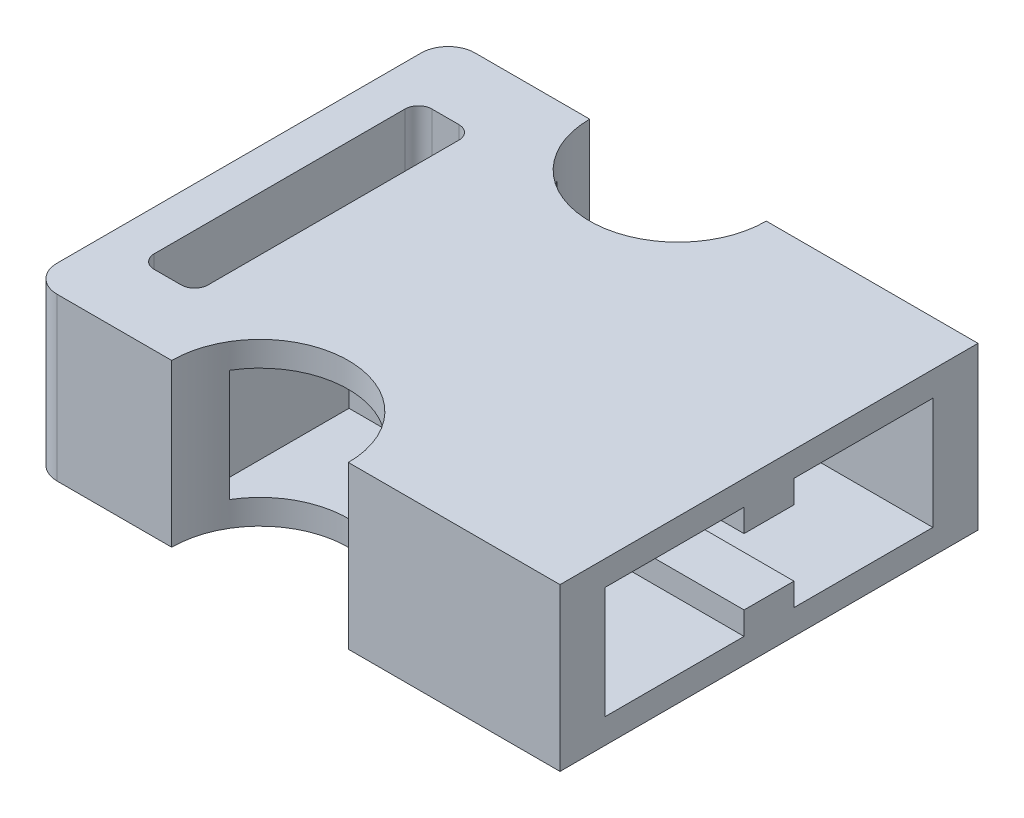
ISO-10303-21;
HEADER;
FILE_DESCRIPTION(('STEP AP214'),'2;1');
FILE_NAME('part.step','',(''),(''),'','','');
FILE_SCHEMA(('AUTOMOTIVE_DESIGN { 1 0 10303 214 1 1 1 1 }'));
ENDSEC;
DATA;
#1=APPLICATION_CONTEXT('core data for automotive mechanical design processes');
#2=APPLICATION_PROTOCOL_DEFINITION('international standard','automotive_design',2000,#1);
#3=PRODUCT_CONTEXT('',#1,'mechanical');
#4=PRODUCT('Part','Part','',(#3));
#5=PRODUCT_RELATED_PRODUCT_CATEGORY('part','',(#4));
#6=PRODUCT_DEFINITION_FORMATION('','',#4);
#7=PRODUCT_DEFINITION_CONTEXT('part definition',#1,'design');
#8=PRODUCT_DEFINITION('design','',#6,#7);
#9=PRODUCT_DEFINITION_SHAPE('','',#8);
#10=(LENGTH_UNIT() NAMED_UNIT(*) SI_UNIT(.MILLI.,.METRE.));
#11=(NAMED_UNIT(*) PLANE_ANGLE_UNIT() SI_UNIT($,.RADIAN.));
#12=(NAMED_UNIT(*) SI_UNIT($,.STERADIAN.) SOLID_ANGLE_UNIT());
#13=UNCERTAINTY_MEASURE_WITH_UNIT(LENGTH_MEASURE(1.E-05),#10,'distance_accuracy_value','');
#14=(GEOMETRIC_REPRESENTATION_CONTEXT(3) GLOBAL_UNCERTAINTY_ASSIGNED_CONTEXT((#13)) GLOBAL_UNIT_ASSIGNED_CONTEXT((#10,
#11,#12)) REPRESENTATION_CONTEXT('',''));
#15=CARTESIAN_POINT('',(0.,0.,0.));
#16=DIRECTION('',(0.,0.,1.));
#17=DIRECTION('',(1.,0.,0.));
#18=AXIS2_PLACEMENT_3D('',#15,#16,#17);
#19=CARTESIAN_POINT('',(0.,12.8905,0.));
#20=DIRECTION('',(0.,-1.,0.));
#21=DIRECTION('',(0.,0.,-1.));
#22=AXIS2_PLACEMENT_3D('',#19,#20,#21);
#23=PLANE('',#22);
#24=DIRECTION('',(0.,0.,1.));
#25=VECTOR('',#24,1.);
#26=CARTESIAN_POINT('',(12.7,12.8905,-35.1155));
#27=LINE('',#26,#25);
#28=CARTESIAN_POINT('',(12.7,12.8905,-17.3355));
#29=VERTEX_POINT('',#28);
#30=CARTESIAN_POINT('',(12.7,12.8905,-4.2545));
#31=VERTEX_POINT('',#30);
#32=EDGE_CURVE('E364',#29,#31,#27,.T.);
#33=ORIENTED_EDGE('',*,*,#32,.F.);
#34=DIRECTION('',(1.,0.,0.));
#35=VECTOR('',#34,1.);
#36=CARTESIAN_POINT('',(12.7,12.8905,-17.3355));
#37=LINE('',#36,#35);
#38=CARTESIAN_POINT('',(49.911,12.8905,-17.3355));
#39=VERTEX_POINT('',#38);
#40=EDGE_CURVE('E660',#29,#39,#37,.T.);
#41=ORIENTED_EDGE('',*,*,#40,.T.);
#42=DIRECTION('',(0.,0.,-1.));
#43=VECTOR('',#42,1.);
#44=CARTESIAN_POINT('',(49.911,12.8905,-35.1155));
#45=LINE('',#44,#43);
#46=CARTESIAN_POINT('',(49.911,12.8905,-4.2545));
#47=VERTEX_POINT('',#46);
#48=EDGE_CURVE('E354',#47,#39,#45,.T.);
#49=ORIENTED_EDGE('',*,*,#48,.F.);
#50=DIRECTION('',(1.,0.,0.));
#51=VECTOR('',#50,1.);
#52=CARTESIAN_POINT('',(49.911,12.8905,-4.2545));
#53=LINE('',#52,#51);
#54=CARTESIAN_POINT('',(28.8016936179709,12.8905,-4.2545));
#55=VERTEX_POINT('',#54);
#56=EDGE_CURVE('E370',#55,#47,#53,.T.);
#57=ORIENTED_EDGE('',*,*,#56,.F.);
#58=CARTESIAN_POINT('',(21.6535,12.8905,0.));
#59=DIRECTION('',(0.,-1.,0.));
#60=DIRECTION('',(0.,0.,-1.));
#61=AXIS2_PLACEMENT_3D('',#58,#59,#60);
#62=CIRCLE('',#61,8.3185);
#63=CARTESIAN_POINT('',(14.5053063820291,12.8905,-4.2545));
#64=VERTEX_POINT('',#63);
#65=EDGE_CURVE('E376',#55,#64,#62,.F.);
#66=ORIENTED_EDGE('',*,*,#65,.T.);
#67=EDGE_CURVE('E368',#31,#64,#53,.T.);
#68=ORIENTED_EDGE('',*,*,#67,.F.);
#69=EDGE_LOOP('',(#33,#41,#49,#57,#66,#68));
#70=FACE_BOUND('',#69,.T.);
#71=ADVANCED_FACE('F44',(#70),#23,.T.);
#72=CARTESIAN_POINT('',(49.911,12.8905,-22.0345));
#73=VERTEX_POINT('',#72);
#74=CARTESIAN_POINT('',(49.911,12.8905,-35.1155));
#75=VERTEX_POINT('',#74);
#76=EDGE_CURVE('E333',#73,#75,#45,.T.);
#77=ORIENTED_EDGE('',*,*,#76,.F.);
#78=DIRECTION('',(-1.,0.,0.));
#79=VECTOR('',#78,1.);
#80=CARTESIAN_POINT('',(12.7,12.8905,-22.0345));
#81=LINE('',#80,#79);
#82=CARTESIAN_POINT('',(12.7,12.8905,-22.0345));
#83=VERTEX_POINT('',#82);
#84=EDGE_CURVE('E665',#73,#83,#81,.T.);
#85=ORIENTED_EDGE('',*,*,#84,.T.);
#86=CARTESIAN_POINT('',(12.7,12.8905,-35.1155));
#87=VERTEX_POINT('',#86);
#88=EDGE_CURVE('E293',#87,#83,#27,.T.);
#89=ORIENTED_EDGE('',*,*,#88,.F.);
#90=DIRECTION('',(-1.,0.,0.));
#91=VECTOR('',#90,1.);
#92=CARTESIAN_POINT('',(49.911,12.8905,-35.1155));
#93=LINE('',#92,#91);
#94=CARTESIAN_POINT('',(14.5053063820291,12.8905,-35.1155));
#95=VERTEX_POINT('',#94);
#96=EDGE_CURVE('E360',#95,#87,#93,.T.);
#97=ORIENTED_EDGE('',*,*,#96,.F.);
#98=CARTESIAN_POINT('',(21.6535,12.8905,-39.37));
#99=DIRECTION('',(0.,-1.,0.));
#100=DIRECTION('',(0.,0.,-1.));
#101=AXIS2_PLACEMENT_3D('',#98,#99,#100);
#102=CIRCLE('',#101,8.3185);
#103=CARTESIAN_POINT('',(28.8016936179709,12.8905,-35.1155));
#104=VERTEX_POINT('',#103);
#105=EDGE_CURVE('E589',#95,#104,#102,.F.);
#106=ORIENTED_EDGE('',*,*,#105,.T.);
#107=EDGE_CURVE('E359',#75,#104,#93,.T.);
#108=ORIENTED_EDGE('',*,*,#107,.F.);
#109=EDGE_LOOP('',(#77,#85,#89,#97,#106,#108));
#110=FACE_BOUND('',#109,.T.);
#111=ADVANCED_FACE('F623',(#110),#23,.T.);
#112=CARTESIAN_POINT('',(12.7,2.3495,-35.1155));
#113=DIRECTION('',(-1.,0.,0.));
#114=DIRECTION('',(0.,0.,1.));
#115=AXIS2_PLACEMENT_3D('',#112,#113,#114);
#116=PLANE('',#115);
#117=DIRECTION('',(0.,1.,0.));
#118=VECTOR('',#117,1.);
#119=CARTESIAN_POINT('',(12.7,10.7315,-22.0345));
#120=LINE('',#119,#118);
#121=CARTESIAN_POINT('',(12.7,10.7315,-22.0345));
#122=VERTEX_POINT('',#121);
#123=EDGE_CURVE('E283',#122,#83,#120,.T.);
#124=ORIENTED_EDGE('',*,*,#123,.F.);
#125=DIRECTION('',(0.,0.,1.));
#126=VECTOR('',#125,1.);
#127=CARTESIAN_POINT('',(12.7,10.7315,-22.0345));
#128=LINE('',#127,#126);
#129=CARTESIAN_POINT('',(12.7,10.7315,-17.3355));
#130=VERTEX_POINT('',#129);
#131=EDGE_CURVE('E268',#122,#130,#128,.T.);
#132=ORIENTED_EDGE('',*,*,#131,.T.);
#133=DIRECTION('',(0.,1.,0.));
#134=VECTOR('',#133,1.);
#135=CARTESIAN_POINT('',(12.7,10.7315,-17.3355));
#136=LINE('',#135,#134);
#137=EDGE_CURVE('E291',#130,#29,#136,.T.);
#138=ORIENTED_EDGE('',*,*,#137,.T.);
#139=ORIENTED_EDGE('',*,*,#32,.T.);
#140=DIRECTION('',(0.,1.,0.));
#141=VECTOR('',#140,1.);
#142=CARTESIAN_POINT('',(12.7,2.3495,-4.2545));
#143=LINE('',#142,#141);
#144=CARTESIAN_POINT('',(12.7,2.3495,-4.2545));
#145=VERTEX_POINT('',#144);
#146=EDGE_CURVE('E380',#145,#31,#143,.T.);
#147=ORIENTED_EDGE('',*,*,#146,.F.);
#148=DIRECTION('',(0.,0.,1.));
#149=VECTOR('',#148,1.);
#150=CARTESIAN_POINT('',(12.7,2.3495,-35.1155));
#151=LINE('',#150,#149);
#152=CARTESIAN_POINT('',(12.7,2.3495,-17.3355));
#153=VERTEX_POINT('',#152);
#154=EDGE_CURVE('E343',#153,#145,#151,.T.);
#155=ORIENTED_EDGE('',*,*,#154,.F.);
#156=DIRECTION('',(0.,-1.,0.));
#157=VECTOR('',#156,1.);
#158=CARTESIAN_POINT('',(12.7,4.5085,-17.3355));
#159=LINE('',#158,#157);
#160=CARTESIAN_POINT('',(12.7,4.5085,-17.3355));
#161=VERTEX_POINT('',#160);
#162=EDGE_CURVE('E320',#161,#153,#159,.T.);
#163=ORIENTED_EDGE('',*,*,#162,.F.);
#164=DIRECTION('',(0.,0.,1.));
#165=VECTOR('',#164,1.);
#166=CARTESIAN_POINT('',(12.7,4.5085,-22.0345));
#167=LINE('',#166,#165);
#168=CARTESIAN_POINT('',(12.7,4.5085,-22.0345));
#169=VERTEX_POINT('',#168);
#170=EDGE_CURVE('E313',#169,#161,#167,.T.);
#171=ORIENTED_EDGE('',*,*,#170,.F.);
#172=DIRECTION('',(0.,-1.,0.));
#173=VECTOR('',#172,1.);
#174=CARTESIAN_POINT('',(12.7,4.5085,-22.0345));
#175=LINE('',#174,#173);
#176=CARTESIAN_POINT('',(12.7,2.3495,-22.0345));
#177=VERTEX_POINT('',#176);
#178=EDGE_CURVE('E70',#169,#177,#175,.T.);
#179=ORIENTED_EDGE('',*,*,#178,.T.);
#180=CARTESIAN_POINT('',(12.7,2.3495,-35.1155));
#181=VERTEX_POINT('',#180);
#182=EDGE_CURVE('E342',#181,#177,#151,.T.);
#183=ORIENTED_EDGE('',*,*,#182,.F.);
#184=DIRECTION('',(0.,1.,0.));
#185=VECTOR('',#184,1.);
#186=CARTESIAN_POINT('',(12.7,2.3495,-35.1155));
#187=LINE('',#186,#185);
#188=EDGE_CURVE('E382',#181,#87,#187,.T.);
#189=ORIENTED_EDGE('',*,*,#188,.T.);
#190=ORIENTED_EDGE('',*,*,#88,.T.);
#191=EDGE_LOOP('',(#124,#132,#138,#139,#147,#155,#163,#171,#179,#183,#189,#190));
#192=FACE_BOUND('',#191,.T.);
#193=ADVANCED_FACE('F288',(#192),#116,.F.);
#194=CARTESIAN_POINT('',(0.,2.3495,0.));
#195=DIRECTION('',(0.,-1.,0.));
#196=DIRECTION('',(0.,0.,-1.));
#197=AXIS2_PLACEMENT_3D('',#194,#195,#196);
#198=PLANE('',#197);
#199=DIRECTION('',(1.,0.,0.));
#200=VECTOR('',#199,1.);
#201=CARTESIAN_POINT('',(12.7,2.3495,-17.3355));
#202=LINE('',#201,#200);
#203=CARTESIAN_POINT('',(49.911,2.3495,-17.3355));
#204=VERTEX_POINT('',#203);
#205=EDGE_CURVE('E300',#153,#204,#202,.T.);
#206=ORIENTED_EDGE('',*,*,#205,.F.);
#207=ORIENTED_EDGE('',*,*,#154,.T.);
#208=DIRECTION('',(1.,0.,0.));
#209=VECTOR('',#208,1.);
#210=CARTESIAN_POINT('',(49.911,2.3495,-4.2545));
#211=LINE('',#210,#209);
#212=CARTESIAN_POINT('',(14.5053063820291,2.3495,-4.2545));
#213=VERTEX_POINT('',#212);
#214=EDGE_CURVE('E346',#145,#213,#211,.T.);
#215=ORIENTED_EDGE('',*,*,#214,.T.);
#216=CARTESIAN_POINT('',(21.6535,2.3495,0.));
#217=DIRECTION('',(0.,-1.,0.));
#218=DIRECTION('',(0.,0.,-1.));
#219=AXIS2_PLACEMENT_3D('',#216,#217,#218);
#220=CIRCLE('',#219,8.3185);
#221=CARTESIAN_POINT('',(28.8016936179709,2.3495,-4.2545));
#222=VERTEX_POINT('',#221);
#223=EDGE_CURVE('E388',#222,#213,#220,.F.);
#224=ORIENTED_EDGE('',*,*,#223,.F.);
#225=CARTESIAN_POINT('',(49.911,2.3495,-4.2545));
#226=VERTEX_POINT('',#225);
#227=EDGE_CURVE('E350',#222,#226,#211,.T.);
#228=ORIENTED_EDGE('',*,*,#227,.T.);
#229=DIRECTION('',(0.,0.,-1.));
#230=VECTOR('',#229,1.);
#231=CARTESIAN_POINT('',(49.911,2.3495,-35.1155));
#232=LINE('',#231,#230);
#233=EDGE_CURVE('E332',#226,#204,#232,.T.);
#234=ORIENTED_EDGE('',*,*,#233,.T.);
#235=EDGE_LOOP('',(#206,#207,#215,#224,#228,#234));
#236=FACE_BOUND('',#235,.T.);
#237=ADVANCED_FACE('F633',(#236),#198,.F.);
#238=DIRECTION('',(-1.,0.,0.));
#239=VECTOR('',#238,1.);
#240=CARTESIAN_POINT('',(12.7,2.3495,-22.0345));
#241=LINE('',#240,#239);
#242=CARTESIAN_POINT('',(49.911,2.3495,-22.0345));
#243=VERTEX_POINT('',#242);
#244=EDGE_CURVE('E308',#243,#177,#241,.T.);
#245=ORIENTED_EDGE('',*,*,#244,.F.);
#246=CARTESIAN_POINT('',(49.911,2.3495,-35.1155));
#247=VERTEX_POINT('',#246);
#248=EDGE_CURVE('E339',#243,#247,#232,.T.);
#249=ORIENTED_EDGE('',*,*,#248,.T.);
#250=DIRECTION('',(-1.,0.,0.));
#251=VECTOR('',#250,1.);
#252=CARTESIAN_POINT('',(49.911,2.3495,-35.1155));
#253=LINE('',#252,#251);
#254=CARTESIAN_POINT('',(28.8016936179709,2.3495,-35.1155));
#255=VERTEX_POINT('',#254);
#256=EDGE_CURVE('E338',#247,#255,#253,.T.);
#257=ORIENTED_EDGE('',*,*,#256,.T.);
#258=CARTESIAN_POINT('',(21.6535,2.3495,-39.37));
#259=DIRECTION('',(0.,-1.,0.));
#260=DIRECTION('',(0.,0.,-1.));
#261=AXIS2_PLACEMENT_3D('',#258,#259,#260);
#262=CIRCLE('',#261,8.3185);
#263=CARTESIAN_POINT('',(14.5053063820291,2.3495,-35.1155));
#264=VERTEX_POINT('',#263);
#265=EDGE_CURVE('E11',#264,#255,#262,.F.);
#266=ORIENTED_EDGE('',*,*,#265,.F.);
#267=EDGE_CURVE('E336',#264,#181,#253,.T.);
#268=ORIENTED_EDGE('',*,*,#267,.T.);
#269=ORIENTED_EDGE('',*,*,#182,.T.);
#270=EDGE_LOOP('',(#245,#249,#257,#266,#268,#269));
#271=FACE_BOUND('',#270,.T.);
#272=ADVANCED_FACE('F608',(#271),#198,.F.);
#273=CARTESIAN_POINT('',(49.911,15.24,-39.37));
#274=DIRECTION('',(-1.,0.,0.));
#275=DIRECTION('',(0.,0.,1.));
#276=AXIS2_PLACEMENT_3D('',#273,#274,#275);
#277=PLANE('',#276);
#278=DIRECTION('',(0.,0.,-1.));
#279=VECTOR('',#278,1.);
#280=CARTESIAN_POINT('',(49.911,0.,-39.37));
#281=LINE('',#280,#279);
#282=CARTESIAN_POINT('',(49.911,0.,0.));
#283=VERTEX_POINT('',#282);
#284=CARTESIAN_POINT('',(49.911,0.,-39.37));
#285=VERTEX_POINT('',#284);
#286=EDGE_CURVE('E424',#283,#285,#281,.T.);
#287=ORIENTED_EDGE('',*,*,#286,.T.);
#288=DIRECTION('',(0.,-1.,0.));
#289=VECTOR('',#288,1.);
#290=CARTESIAN_POINT('',(49.911,15.24,-39.37));
#291=LINE('',#290,#289);
#292=CARTESIAN_POINT('',(49.911,15.24,-39.37));
#293=VERTEX_POINT('',#292);
#294=EDGE_CURVE('E441',#293,#285,#291,.T.);
#295=ORIENTED_EDGE('',*,*,#294,.F.);
#296=DIRECTION('',(0.,0.,-1.));
#297=VECTOR('',#296,1.);
#298=CARTESIAN_POINT('',(49.911,15.24,-39.37));
#299=LINE('',#298,#297);
#300=CARTESIAN_POINT('',(49.911,15.24,0.));
#301=VERTEX_POINT('',#300);
#302=EDGE_CURVE('E408',#301,#293,#299,.T.);
#303=ORIENTED_EDGE('',*,*,#302,.F.);
#304=DIRECTION('',(0.,-1.,0.));
#305=VECTOR('',#304,1.);
#306=CARTESIAN_POINT('',(49.911,15.24,0.));
#307=LINE('',#306,#305);
#308=EDGE_CURVE('E444',#301,#283,#307,.T.);
#309=ORIENTED_EDGE('',*,*,#308,.T.);
#310=EDGE_LOOP('',(#287,#295,#303,#309));
#311=FACE_BOUND('',#310,.T.);
#312=ORIENTED_EDGE('',*,*,#233,.F.);
#313=DIRECTION('',(0.,1.,0.));
#314=VECTOR('',#313,1.);
#315=CARTESIAN_POINT('',(49.911,2.3495,-4.2545));
#316=LINE('',#315,#314);
#317=EDGE_CURVE('E375',#226,#47,#316,.T.);
#318=ORIENTED_EDGE('',*,*,#317,.T.);
#319=ORIENTED_EDGE('',*,*,#48,.T.);
#320=DIRECTION('',(0.,1.,0.));
#321=VECTOR('',#320,1.);
#322=CARTESIAN_POINT('',(49.911,10.7315,-17.3355));
#323=LINE('',#322,#321);
#324=CARTESIAN_POINT('',(49.911,10.7315,-17.3355));
#325=VERTEX_POINT('',#324);
#326=EDGE_CURVE('E299',#325,#39,#323,.T.);
#327=ORIENTED_EDGE('',*,*,#326,.F.);
#328=DIRECTION('',(0.,0.,-1.));
#329=VECTOR('',#328,1.);
#330=CARTESIAN_POINT('',(49.911,10.7315,-17.3355));
#331=LINE('',#330,#329);
#332=CARTESIAN_POINT('',(49.911,10.7315,-22.0345));
#333=VERTEX_POINT('',#332);
#334=EDGE_CURVE('E281',#325,#333,#331,.T.);
#335=ORIENTED_EDGE('',*,*,#334,.T.);
#336=DIRECTION('',(0.,1.,0.));
#337=VECTOR('',#336,1.);
#338=CARTESIAN_POINT('',(49.911,10.7315,-22.0345));
#339=LINE('',#338,#337);
#340=EDGE_CURVE('E282',#333,#73,#339,.T.);
#341=ORIENTED_EDGE('',*,*,#340,.T.);
#342=ORIENTED_EDGE('',*,*,#76,.T.);
#343=DIRECTION('',(0.,1.,0.));
#344=VECTOR('',#343,1.);
#345=CARTESIAN_POINT('',(49.911,2.3495,-35.1155));
#346=LINE('',#345,#344);
#347=EDGE_CURVE('E352',#247,#75,#346,.T.);
#348=ORIENTED_EDGE('',*,*,#347,.F.);
#349=ORIENTED_EDGE('',*,*,#248,.F.);
#350=DIRECTION('',(0.,-1.,0.));
#351=VECTOR('',#350,1.);
#352=CARTESIAN_POINT('',(49.911,4.5085,-22.0345));
#353=LINE('',#352,#351);
#354=CARTESIAN_POINT('',(49.911,4.5085,-22.0345));
#355=VERTEX_POINT('',#354);
#356=EDGE_CURVE('E329',#355,#243,#353,.T.);
#357=ORIENTED_EDGE('',*,*,#356,.F.);
#358=DIRECTION('',(0.,0.,-1.));
#359=VECTOR('',#358,1.);
#360=CARTESIAN_POINT('',(49.911,4.5085,-17.3355));
#361=LINE('',#360,#359);
#362=CARTESIAN_POINT('',(49.911,4.5085,-17.3355));
#363=VERTEX_POINT('',#362);
#364=EDGE_CURVE('E310',#363,#355,#361,.T.);
#365=ORIENTED_EDGE('',*,*,#364,.F.);
#366=DIRECTION('',(0.,-1.,0.));
#367=VECTOR('',#366,1.);
#368=CARTESIAN_POINT('',(49.911,4.5085,-17.3355));
#369=LINE('',#368,#367);
#370=EDGE_CURVE('E326',#363,#204,#369,.T.);
#371=ORIENTED_EDGE('',*,*,#370,.T.);
#372=EDGE_LOOP('',(#312,#318,#319,#327,#335,#341,#342,#348,#349,#357,#365,#371));
#373=FACE_BOUND('',#372,.T.);
#374=ADVANCED_FACE('F620',(#311,#373),#277,.F.);
#375=CARTESIAN_POINT('',(2.54,15.24,-36.83));
#376=DIRECTION('',(0.,1.,0.));
#377=DIRECTION('',(0.,0.,1.));
#378=AXIS2_PLACEMENT_3D('',#375,#376,#377);
#379=PLANE('',#378);
#380=DIRECTION('',(1.,0.,0.));
#381=VECTOR('',#380,1.);
#382=CARTESIAN_POINT('',(10.16,15.24,0.));
#383=LINE('',#382,#381);
#384=CARTESIAN_POINT('',(2.54,15.24,0.));
#385=VERTEX_POINT('',#384);
#386=CARTESIAN_POINT('',(13.335,15.24,0.));
#387=VERTEX_POINT('',#386);
#388=EDGE_CURVE('E543',#385,#387,#383,.T.);
#389=ORIENTED_EDGE('',*,*,#388,.T.);
#390=CARTESIAN_POINT('',(21.6535,15.24,0.));
#391=DIRECTION('',(0.,-1.,0.));
#392=DIRECTION('',(0.,0.,-1.));
#393=AXIS2_PLACEMENT_3D('',#390,#391,#392);
#394=CIRCLE('',#393,8.3185);
#395=CARTESIAN_POINT('',(29.972,15.24,0.));
#396=VERTEX_POINT('',#395);
#397=EDGE_CURVE('E405',#387,#396,#394,.T.);
#398=ORIENTED_EDGE('',*,*,#397,.T.);
#399=DIRECTION('',(1.,0.,0.));
#400=VECTOR('',#399,1.);
#401=CARTESIAN_POINT('',(29.972,15.24,0.));
#402=LINE('',#401,#400);
#403=EDGE_CURVE('E403',#396,#301,#402,.T.);
#404=ORIENTED_EDGE('',*,*,#403,.T.);
#405=ORIENTED_EDGE('',*,*,#302,.T.);
#406=DIRECTION('',(-1.,0.,0.));
#407=VECTOR('',#406,1.);
#408=CARTESIAN_POINT('',(29.972,15.24,-39.37));
#409=LINE('',#408,#407);
#410=CARTESIAN_POINT('',(29.972,15.24,-39.37));
#411=VERTEX_POINT('',#410);
#412=EDGE_CURVE('E414',#293,#411,#409,.T.);
#413=ORIENTED_EDGE('',*,*,#412,.T.);
#414=CARTESIAN_POINT('',(21.6535,15.24,-39.37));
#415=DIRECTION('',(0.,-1.,0.));
#416=DIRECTION('',(0.,0.,1.));
#417=AXIS2_PLACEMENT_3D('',#414,#415,#416);
#418=CIRCLE('',#417,8.3185);
#419=CARTESIAN_POINT('',(13.335,15.24,-39.37));
#420=VERTEX_POINT('',#419);
#421=EDGE_CURVE('E411',#411,#420,#418,.T.);
#422=ORIENTED_EDGE('',*,*,#421,.T.);
#423=DIRECTION('',(-1.,0.,0.));
#424=VECTOR('',#423,1.);
#425=CARTESIAN_POINT('',(10.16,15.24,-39.37));
#426=LINE('',#425,#424);
#427=CARTESIAN_POINT('',(2.54000000000002,15.24,-39.37));
#428=VERTEX_POINT('',#427);
#429=EDGE_CURVE('E545',#420,#428,#426,.T.);
#430=ORIENTED_EDGE('',*,*,#429,.T.);
#431=CARTESIAN_POINT('',(2.54,15.24,-36.83));
#432=DIRECTION('',(0.,1.,0.));
#433=DIRECTION('',(0.,0.,1.));
#434=AXIS2_PLACEMENT_3D('',#431,#432,#433);
#435=CIRCLE('',#434,2.54);
#436=CARTESIAN_POINT('',(0.,15.24,-36.83));
#437=VERTEX_POINT('',#436);
#438=EDGE_CURVE('E548',#428,#437,#435,.T.);
#439=ORIENTED_EDGE('',*,*,#438,.T.);
#440=DIRECTION('',(0.,0.,1.));
#441=VECTOR('',#440,1.);
#442=CARTESIAN_POINT('',(0.,15.24,-2.54000000000002));
#443=LINE('',#442,#441);
#444=CARTESIAN_POINT('',(0.,15.24,-2.54000000000002));
#445=VERTEX_POINT('',#444);
#446=EDGE_CURVE('E553',#437,#445,#443,.T.);
#447=ORIENTED_EDGE('',*,*,#446,.T.);
#448=CARTESIAN_POINT('',(2.54,15.24,-2.54));
#449=DIRECTION('',(0.,1.,0.));
#450=DIRECTION('',(0.,0.,1.));
#451=AXIS2_PLACEMENT_3D('',#448,#449,#450);
#452=CIRCLE('',#451,2.54);
#453=EDGE_CURVE('E555',#445,#385,#452,.T.);
#454=ORIENTED_EDGE('',*,*,#453,.T.);
#455=EDGE_LOOP('',(#389,#398,#404,#405,#413,#422,#430,#439,#447,#454));
#456=FACE_BOUND('',#455,.T.);
#457=DIRECTION('',(1.,0.,0.));
#458=VECTOR('',#457,1.);
#459=CARTESIAN_POINT('',(5.08000000000001,15.24,-6.604));
#460=LINE('',#459,#458);
#461=CARTESIAN_POINT('',(5.08000000000001,15.24,-6.604));
#462=VERTEX_POINT('',#461);
#463=CARTESIAN_POINT('',(7.61999999999999,15.24,-6.604));
#464=VERTEX_POINT('',#463);
#465=EDGE_CURVE('E461',#462,#464,#460,.T.);
#466=ORIENTED_EDGE('',*,*,#465,.F.);
#467=CARTESIAN_POINT('',(5.08,15.24,-7.874));
#468=DIRECTION('',(0.,1.,0.));
#469=DIRECTION('',(0.,0.,1.));
#470=AXIS2_PLACEMENT_3D('',#467,#468,#469);
#471=CIRCLE('',#470,1.27);
#472=CARTESIAN_POINT('',(3.81,15.24,-7.87400000000001));
#473=VERTEX_POINT('',#472);
#474=EDGE_CURVE('E457',#473,#462,#471,.T.);
#475=ORIENTED_EDGE('',*,*,#474,.F.);
#476=DIRECTION('',(0.,0.,1.));
#477=VECTOR('',#476,1.);
#478=CARTESIAN_POINT('',(3.81,15.24,-31.496));
#479=LINE('',#478,#477);
#480=CARTESIAN_POINT('',(3.81,15.24,-31.496));
#481=VERTEX_POINT('',#480);
#482=EDGE_CURVE('E481',#481,#473,#479,.T.);
#483=ORIENTED_EDGE('',*,*,#482,.F.);
#484=CARTESIAN_POINT('',(5.08,15.24,-31.496));
#485=DIRECTION('',(0.,1.,0.));
#486=DIRECTION('',(0.,0.,1.));
#487=AXIS2_PLACEMENT_3D('',#484,#485,#486);
#488=CIRCLE('',#487,1.27);
#489=CARTESIAN_POINT('',(5.08000000000001,15.24,-32.766));
#490=VERTEX_POINT('',#489);
#491=EDGE_CURVE('E479',#490,#481,#488,.T.);
#492=ORIENTED_EDGE('',*,*,#491,.F.);
#493=DIRECTION('',(-1.,0.,0.));
#494=VECTOR('',#493,1.);
#495=CARTESIAN_POINT('',(5.08000000000001,15.24,-32.766));
#496=LINE('',#495,#494);
#497=CARTESIAN_POINT('',(7.61999999999999,15.24,-32.766));
#498=VERTEX_POINT('',#497);
#499=EDGE_CURVE('E473',#498,#490,#496,.T.);
#500=ORIENTED_EDGE('',*,*,#499,.F.);
#501=CARTESIAN_POINT('',(7.62,15.24,-31.496));
#502=DIRECTION('',(0.,1.,0.));
#503=DIRECTION('',(0.,0.,1.));
#504=AXIS2_PLACEMENT_3D('',#501,#502,#503);
#505=CIRCLE('',#504,1.27);
#506=CARTESIAN_POINT('',(8.89,15.24,-31.496));
#507=VERTEX_POINT('',#506);
#508=EDGE_CURVE('E474',#507,#498,#505,.T.);
#509=ORIENTED_EDGE('',*,*,#508,.F.);
#510=DIRECTION('',(0.,0.,-1.));
#511=VECTOR('',#510,1.);
#512=CARTESIAN_POINT('',(8.89,15.24,-31.496));
#513=LINE('',#512,#511);
#514=CARTESIAN_POINT('',(8.89,15.24,-7.87400000000001));
#515=VERTEX_POINT('',#514);
#516=EDGE_CURVE('E466',#515,#507,#513,.T.);
#517=ORIENTED_EDGE('',*,*,#516,.F.);
#518=CARTESIAN_POINT('',(7.62,15.24,-7.874));
#519=DIRECTION('',(0.,1.,0.));
#520=DIRECTION('',(0.,0.,1.));
#521=AXIS2_PLACEMENT_3D('',#518,#519,#520);
#522=CIRCLE('',#521,1.27);
#523=EDGE_CURVE('E464',#464,#515,#522,.T.);
#524=ORIENTED_EDGE('',*,*,#523,.F.);
#525=EDGE_LOOP('',(#466,#475,#483,#492,#500,#509,#517,#524));
#526=FACE_BOUND('',#525,.T.);
#527=ADVANCED_FACE('F703',(#456,#526),#379,.T.);
#528=CARTESIAN_POINT('',(2.54,0.,-36.83));
#529=DIRECTION('',(0.,1.,0.));
#530=DIRECTION('',(0.,0.,1.));
#531=AXIS2_PLACEMENT_3D('',#528,#529,#530);
#532=PLANE('',#531);
#533=DIRECTION('',(-1.,0.,0.));
#534=VECTOR('',#533,1.);
#535=CARTESIAN_POINT('',(2.54000000000002,0.,-39.37));
#536=LINE('',#535,#534);
#537=CARTESIAN_POINT('',(13.335,0.,-39.37));
#538=VERTEX_POINT('',#537);
#539=CARTESIAN_POINT('',(2.54000000000002,0.,-39.37));
#540=VERTEX_POINT('',#539);
#541=EDGE_CURVE('E537',#538,#540,#536,.T.);
#542=ORIENTED_EDGE('',*,*,#541,.F.);
#543=CARTESIAN_POINT('',(21.6535,0.,-39.37));
#544=DIRECTION('',(0.,-1.,0.));
#545=DIRECTION('',(0.,0.,1.));
#546=AXIS2_PLACEMENT_3D('',#543,#544,#545);
#547=CIRCLE('',#546,8.3185);
#548=CARTESIAN_POINT('',(29.972,0.,-39.37));
#549=VERTEX_POINT('',#548);
#550=EDGE_CURVE('E409',#549,#538,#547,.T.);
#551=ORIENTED_EDGE('',*,*,#550,.F.);
#552=DIRECTION('',(-1.,0.,0.));
#553=VECTOR('',#552,1.);
#554=CARTESIAN_POINT('',(29.972,0.,-39.37));
#555=LINE('',#554,#553);
#556=EDGE_CURVE('E426',#285,#549,#555,.T.);
#557=ORIENTED_EDGE('',*,*,#556,.F.);
#558=ORIENTED_EDGE('',*,*,#286,.F.);
#559=DIRECTION('',(1.,0.,0.));
#560=VECTOR('',#559,1.);
#561=CARTESIAN_POINT('',(29.972,0.,0.));
#562=LINE('',#561,#560);
#563=CARTESIAN_POINT('',(29.972,0.,0.));
#564=VERTEX_POINT('',#563);
#565=EDGE_CURVE('E422',#564,#283,#562,.T.);
#566=ORIENTED_EDGE('',*,*,#565,.F.);
#567=CARTESIAN_POINT('',(21.6535,0.,0.));
#568=DIRECTION('',(0.,-1.,0.));
#569=DIRECTION('',(0.,0.,-1.));
#570=AXIS2_PLACEMENT_3D('',#567,#568,#569);
#571=CIRCLE('',#570,8.3185);
#572=CARTESIAN_POINT('',(13.335,0.,0.));
#573=VERTEX_POINT('',#572);
#574=EDGE_CURVE('E402',#573,#564,#571,.T.);
#575=ORIENTED_EDGE('',*,*,#574,.F.);
#576=DIRECTION('',(1.,0.,0.));
#577=VECTOR('',#576,1.);
#578=CARTESIAN_POINT('',(2.54000000000002,0.,0.));
#579=LINE('',#578,#577);
#580=CARTESIAN_POINT('',(2.54,0.,0.));
#581=VERTEX_POINT('',#580);
#582=EDGE_CURVE('E541',#581,#573,#579,.T.);
#583=ORIENTED_EDGE('',*,*,#582,.F.);
#584=CARTESIAN_POINT('',(2.54,0.,-2.54));
#585=DIRECTION('',(0.,1.,0.));
#586=DIRECTION('',(0.,0.,1.));
#587=AXIS2_PLACEMENT_3D('',#584,#585,#586);
#588=CIRCLE('',#587,2.54);
#589=CARTESIAN_POINT('',(0.,0.,-2.54000000000002));
#590=VERTEX_POINT('',#589);
#591=EDGE_CURVE('E570',#590,#581,#588,.T.);
#592=ORIENTED_EDGE('',*,*,#591,.F.);
#593=DIRECTION('',(0.,0.,1.));
#594=VECTOR('',#593,1.);
#595=CARTESIAN_POINT('',(0.,0.,-2.54000000000002));
#596=LINE('',#595,#594);
#597=CARTESIAN_POINT('',(0.,0.,-36.83));
#598=VERTEX_POINT('',#597);
#599=EDGE_CURVE('E562',#598,#590,#596,.T.);
#600=ORIENTED_EDGE('',*,*,#599,.F.);
#601=CARTESIAN_POINT('',(2.54,0.,-36.83));
#602=DIRECTION('',(0.,1.,0.));
#603=DIRECTION('',(0.,0.,1.));
#604=AXIS2_PLACEMENT_3D('',#601,#602,#603);
#605=CIRCLE('',#604,2.54);
#606=EDGE_CURVE('E561',#540,#598,#605,.T.);
#607=ORIENTED_EDGE('',*,*,#606,.F.);
#608=EDGE_LOOP('',(#542,#551,#557,#558,#566,#575,#583,#592,#600,#607));
#609=FACE_BOUND('',#608,.T.);
#610=CARTESIAN_POINT('',(5.08,0.,-7.874));
#611=DIRECTION('',(0.,1.,0.));
#612=DIRECTION('',(0.,0.,1.));
#613=AXIS2_PLACEMENT_3D('',#610,#611,#612);
#614=CIRCLE('',#613,1.27);
#615=CARTESIAN_POINT('',(3.81,0.,-7.87400000000001));
#616=VERTEX_POINT('',#615);
#617=CARTESIAN_POINT('',(5.08000000000001,0.,-6.604));
#618=VERTEX_POINT('',#617);
#619=EDGE_CURVE('E459',#616,#618,#614,.T.);
#620=ORIENTED_EDGE('',*,*,#619,.T.);
#621=DIRECTION('',(1.,0.,0.));
#622=VECTOR('',#621,1.);
#623=CARTESIAN_POINT('',(5.08000000000001,0.,-6.604));
#624=LINE('',#623,#622);
#625=CARTESIAN_POINT('',(7.61999999999999,0.,-6.604));
#626=VERTEX_POINT('',#625);
#627=EDGE_CURVE('E486',#618,#626,#624,.T.);
#628=ORIENTED_EDGE('',*,*,#627,.T.);
#629=CARTESIAN_POINT('',(7.62,0.,-7.874));
#630=DIRECTION('',(0.,1.,0.));
#631=DIRECTION('',(0.,0.,1.));
#632=AXIS2_PLACEMENT_3D('',#629,#630,#631);
#633=CIRCLE('',#632,1.27);
#634=CARTESIAN_POINT('',(8.89,0.,-7.87400000000001));
#635=VERTEX_POINT('',#634);
#636=EDGE_CURVE('E495',#626,#635,#633,.T.);
#637=ORIENTED_EDGE('',*,*,#636,.T.);
#638=DIRECTION('',(0.,0.,-1.));
#639=VECTOR('',#638,1.);
#640=CARTESIAN_POINT('',(8.89,0.,-31.496));
#641=LINE('',#640,#639);
#642=CARTESIAN_POINT('',(8.89,0.,-31.496));
#643=VERTEX_POINT('',#642);
#644=EDGE_CURVE('E496',#635,#643,#641,.T.);
#645=ORIENTED_EDGE('',*,*,#644,.T.);
#646=CARTESIAN_POINT('',(7.62,0.,-31.496));
#647=DIRECTION('',(0.,1.,0.));
#648=DIRECTION('',(0.,0.,1.));
#649=AXIS2_PLACEMENT_3D('',#646,#647,#648);
#650=CIRCLE('',#649,1.27);
#651=CARTESIAN_POINT('',(7.61999999999999,0.,-32.766));
#652=VERTEX_POINT('',#651);
#653=EDGE_CURVE('E499',#643,#652,#650,.T.);
#654=ORIENTED_EDGE('',*,*,#653,.T.);
#655=DIRECTION('',(-1.,0.,0.));
#656=VECTOR('',#655,1.);
#657=CARTESIAN_POINT('',(5.08000000000001,0.,-32.766));
#658=LINE('',#657,#656);
#659=CARTESIAN_POINT('',(5.08000000000001,0.,-32.766));
#660=VERTEX_POINT('',#659);
#661=EDGE_CURVE('E502',#652,#660,#658,.T.);
#662=ORIENTED_EDGE('',*,*,#661,.T.);
#663=CARTESIAN_POINT('',(5.08,0.,-31.496));
#664=DIRECTION('',(0.,1.,0.));
#665=DIRECTION('',(0.,0.,1.));
#666=AXIS2_PLACEMENT_3D('',#663,#664,#665);
#667=CIRCLE('',#666,1.27);
#668=CARTESIAN_POINT('',(3.81,0.,-31.496));
#669=VERTEX_POINT('',#668);
#670=EDGE_CURVE('E507',#660,#669,#667,.T.);
#671=ORIENTED_EDGE('',*,*,#670,.T.);
#672=DIRECTION('',(0.,0.,1.));
#673=VECTOR('',#672,1.);
#674=CARTESIAN_POINT('',(3.81,0.,-31.496));
#675=LINE('',#674,#673);
#676=EDGE_CURVE('E465',#669,#616,#675,.T.);
#677=ORIENTED_EDGE('',*,*,#676,.T.);
#678=EDGE_LOOP('',(#620,#628,#637,#645,#654,#662,#671,#677));
#679=FACE_BOUND('',#678,.T.);
#680=ADVANCED_FACE('F748',(#609,#679),#532,.F.);
#681=CARTESIAN_POINT('',(2.54000000000002,15.24,-39.37));
#682=DIRECTION('',(0.,0.,1.));
#683=DIRECTION('',(1.,0.,0.));
#684=AXIS2_PLACEMENT_3D('',#681,#682,#683);
#685=PLANE('',#684);
#686=ORIENTED_EDGE('',*,*,#541,.T.);
#687=DIRECTION('',(0.,-1.,0.));
#688=VECTOR('',#687,1.);
#689=CARTESIAN_POINT('',(2.54000000000002,15.24,-39.37));
#690=LINE('',#689,#688);
#691=EDGE_CURVE('E585',#428,#540,#690,.T.);
#692=ORIENTED_EDGE('',*,*,#691,.F.);
#693=ORIENTED_EDGE('',*,*,#429,.F.);
#694=DIRECTION('',(0.,-1.,0.));
#695=VECTOR('',#694,1.);
#696=CARTESIAN_POINT('',(13.335,15.24,-39.37));
#697=LINE('',#696,#695);
#698=EDGE_CURVE('E417',#420,#538,#697,.T.);
#699=ORIENTED_EDGE('',*,*,#698,.T.);
#700=EDGE_LOOP('',(#686,#692,#693,#699));
#701=FACE_BOUND('',#700,.T.);
#702=ADVANCED_FACE('F50',(#701),#685,.F.);
#703=CARTESIAN_POINT('',(2.54,15.24,-36.83));
#704=DIRECTION('',(0.,-1.,0.));
#705=DIRECTION('',(0.,0.,-1.));
#706=AXIS2_PLACEMENT_3D('',#703,#704,#705);
#707=CYLINDRICAL_SURFACE('',#706,2.54);
#708=ORIENTED_EDGE('',*,*,#606,.T.);
#709=DIRECTION('',(0.,-1.,0.));
#710=VECTOR('',#709,1.);
#711=CARTESIAN_POINT('',(0.,15.24,-36.83));
#712=LINE('',#711,#710);
#713=EDGE_CURVE('E576',#437,#598,#712,.T.);
#714=ORIENTED_EDGE('',*,*,#713,.F.);
#715=ORIENTED_EDGE('',*,*,#438,.F.);
#716=ORIENTED_EDGE('',*,*,#691,.T.);
#717=EDGE_LOOP('',(#708,#714,#715,#716));
#718=FACE_BOUND('',#717,.T.);
#719=ADVANCED_FACE('F759',(#718),#707,.T.);
#720=CARTESIAN_POINT('',(0.,15.24,-2.54000000000002));
#721=DIRECTION('',(1.,0.,0.));
#722=DIRECTION('',(0.,0.,-1.));
#723=AXIS2_PLACEMENT_3D('',#720,#721,#722);
#724=PLANE('',#723);
#725=ORIENTED_EDGE('',*,*,#599,.T.);
#726=DIRECTION('',(0.,-1.,0.));
#727=VECTOR('',#726,1.);
#728=CARTESIAN_POINT('',(0.,15.24,-2.54000000000002));
#729=LINE('',#728,#727);
#730=EDGE_CURVE('E574',#445,#590,#729,.T.);
#731=ORIENTED_EDGE('',*,*,#730,.F.);
#732=ORIENTED_EDGE('',*,*,#446,.F.);
#733=ORIENTED_EDGE('',*,*,#713,.T.);
#734=EDGE_LOOP('',(#725,#731,#732,#733));
#735=FACE_BOUND('',#734,.T.);
#736=ADVANCED_FACE('F760',(#735),#724,.F.);
#737=CARTESIAN_POINT('',(2.54,15.24,-2.54));
#738=DIRECTION('',(0.,-1.,0.));
#739=DIRECTION('',(0.,0.,-1.));
#740=AXIS2_PLACEMENT_3D('',#737,#738,#739);
#741=CYLINDRICAL_SURFACE('',#740,2.54);
#742=ORIENTED_EDGE('',*,*,#591,.T.);
#743=DIRECTION('',(0.,-1.,0.));
#744=VECTOR('',#743,1.);
#745=CARTESIAN_POINT('',(2.54,15.24,0.));
#746=LINE('',#745,#744);
#747=EDGE_CURVE('E556',#385,#581,#746,.T.);
#748=ORIENTED_EDGE('',*,*,#747,.F.);
#749=ORIENTED_EDGE('',*,*,#453,.F.);
#750=ORIENTED_EDGE('',*,*,#730,.T.);
#751=EDGE_LOOP('',(#742,#748,#749,#750));
#752=FACE_BOUND('',#751,.T.);
#753=ADVANCED_FACE('F751',(#752),#741,.T.);
#754=CARTESIAN_POINT('',(2.54000000000002,15.24,0.));
#755=DIRECTION('',(0.,0.,-1.));
#756=DIRECTION('',(-1.,0.,0.));
#757=AXIS2_PLACEMENT_3D('',#754,#755,#756);
#758=PLANE('',#757);
#759=ORIENTED_EDGE('',*,*,#582,.T.);
#760=DIRECTION('',(0.,-1.,0.));
#761=VECTOR('',#760,1.);
#762=CARTESIAN_POINT('',(13.335,15.24,0.));
#763=LINE('',#762,#761);
#764=EDGE_CURVE('E455',#387,#573,#763,.T.);
#765=ORIENTED_EDGE('',*,*,#764,.F.);
#766=ORIENTED_EDGE('',*,*,#388,.F.);
#767=ORIENTED_EDGE('',*,*,#747,.T.);
#768=EDGE_LOOP('',(#759,#765,#766,#767));
#769=FACE_BOUND('',#768,.T.);
#770=ADVANCED_FACE('F745',(#769),#758,.F.);
#771=CARTESIAN_POINT('',(5.08,15.24,-7.874));
#772=DIRECTION('',(0.,-1.,0.));
#773=DIRECTION('',(0.,0.,-1.));
#774=AXIS2_PLACEMENT_3D('',#771,#772,#773);
#775=CYLINDRICAL_SURFACE('',#774,1.27);
#776=ORIENTED_EDGE('',*,*,#619,.F.);
#777=DIRECTION('',(0.,-1.,0.));
#778=VECTOR('',#777,1.);
#779=CARTESIAN_POINT('',(3.81,15.24,-7.87400000000001));
#780=LINE('',#779,#778);
#781=EDGE_CURVE('E482',#473,#616,#780,.T.);
#782=ORIENTED_EDGE('',*,*,#781,.F.);
#783=ORIENTED_EDGE('',*,*,#474,.T.);
#784=DIRECTION('',(0.,-1.,0.));
#785=VECTOR('',#784,1.);
#786=CARTESIAN_POINT('',(5.08000000000001,15.24,-6.604));
#787=LINE('',#786,#785);
#788=EDGE_CURVE('E539',#462,#618,#787,.T.);
#789=ORIENTED_EDGE('',*,*,#788,.T.);
#790=EDGE_LOOP('',(#776,#782,#783,#789));
#791=FACE_BOUND('',#790,.T.);
#792=ADVANCED_FACE('F737',(#791),#775,.F.);
#793=CARTESIAN_POINT('',(5.08000000000001,15.24,-6.604));
#794=DIRECTION('',(0.,0.,-1.));
#795=DIRECTION('',(-1.,0.,0.));
#796=AXIS2_PLACEMENT_3D('',#793,#794,#795);
#797=PLANE('',#796);
#798=ORIENTED_EDGE('',*,*,#627,.F.);
#799=ORIENTED_EDGE('',*,*,#788,.F.);
#800=ORIENTED_EDGE('',*,*,#465,.T.);
#801=DIRECTION('',(0.,-1.,0.));
#802=VECTOR('',#801,1.);
#803=CARTESIAN_POINT('',(7.61999999999999,15.24,-6.604));
#804=LINE('',#803,#802);
#805=EDGE_CURVE('E531',#464,#626,#804,.T.);
#806=ORIENTED_EDGE('',*,*,#805,.T.);
#807=EDGE_LOOP('',(#798,#799,#800,#806));
#808=FACE_BOUND('',#807,.T.);
#809=ADVANCED_FACE('F733',(#808),#797,.T.);
#810=CARTESIAN_POINT('',(7.62,15.24,-7.874));
#811=DIRECTION('',(0.,-1.,0.));
#812=DIRECTION('',(0.,0.,-1.));
#813=AXIS2_PLACEMENT_3D('',#810,#811,#812);
#814=CYLINDRICAL_SURFACE('',#813,1.27);
#815=ORIENTED_EDGE('',*,*,#636,.F.);
#816=ORIENTED_EDGE('',*,*,#805,.F.);
#817=ORIENTED_EDGE('',*,*,#523,.T.);
#818=DIRECTION('',(0.,-1.,0.));
#819=VECTOR('',#818,1.);
#820=CARTESIAN_POINT('',(8.89,15.24,-7.87400000000001));
#821=LINE('',#820,#819);
#822=EDGE_CURVE('E529',#515,#635,#821,.T.);
#823=ORIENTED_EDGE('',*,*,#822,.T.);
#824=EDGE_LOOP('',(#815,#816,#817,#823));
#825=FACE_BOUND('',#824,.T.);
#826=ADVANCED_FACE('F728',(#825),#814,.F.);
#827=CARTESIAN_POINT('',(8.89,15.24,-31.496));
#828=DIRECTION('',(-1.,0.,0.));
#829=DIRECTION('',(0.,0.,1.));
#830=AXIS2_PLACEMENT_3D('',#827,#828,#829);
#831=PLANE('',#830);
#832=ORIENTED_EDGE('',*,*,#644,.F.);
#833=ORIENTED_EDGE('',*,*,#822,.F.);
#834=ORIENTED_EDGE('',*,*,#516,.T.);
#835=DIRECTION('',(0.,-1.,0.));
#836=VECTOR('',#835,1.);
#837=CARTESIAN_POINT('',(8.89,15.24,-31.496));
#838=LINE('',#837,#836);
#839=EDGE_CURVE('E530',#507,#643,#838,.T.);
#840=ORIENTED_EDGE('',*,*,#839,.T.);
#841=EDGE_LOOP('',(#832,#833,#834,#840));
#842=FACE_BOUND('',#841,.T.);
#843=ADVANCED_FACE('F727',(#842),#831,.T.);
#844=CARTESIAN_POINT('',(7.62,15.24,-31.496));
#845=DIRECTION('',(0.,-1.,0.));
#846=DIRECTION('',(0.,0.,-1.));
#847=AXIS2_PLACEMENT_3D('',#844,#845,#846);
#848=CYLINDRICAL_SURFACE('',#847,1.27);
#849=ORIENTED_EDGE('',*,*,#653,.F.);
#850=ORIENTED_EDGE('',*,*,#839,.F.);
#851=ORIENTED_EDGE('',*,*,#508,.T.);
#852=DIRECTION('',(0.,-1.,0.));
#853=VECTOR('',#852,1.);
#854=CARTESIAN_POINT('',(7.61999999999999,15.24,-32.766));
#855=LINE('',#854,#853);
#856=EDGE_CURVE('E525',#498,#652,#855,.T.);
#857=ORIENTED_EDGE('',*,*,#856,.T.);
#858=EDGE_LOOP('',(#849,#850,#851,#857));
#859=FACE_BOUND('',#858,.T.);
#860=ADVANCED_FACE('F725',(#859),#848,.F.);
#861=CARTESIAN_POINT('',(5.08000000000001,15.24,-32.766));
#862=DIRECTION('',(0.,0.,1.));
#863=DIRECTION('',(1.,0.,0.));
#864=AXIS2_PLACEMENT_3D('',#861,#862,#863);
#865=PLANE('',#864);
#866=ORIENTED_EDGE('',*,*,#661,.F.);
#867=ORIENTED_EDGE('',*,*,#856,.F.);
#868=ORIENTED_EDGE('',*,*,#499,.T.);
#869=DIRECTION('',(0.,-1.,0.));
#870=VECTOR('',#869,1.);
#871=CARTESIAN_POINT('',(5.08000000000001,15.24,-32.766));
#872=LINE('',#871,#870);
#873=EDGE_CURVE('E523',#490,#660,#872,.T.);
#874=ORIENTED_EDGE('',*,*,#873,.T.);
#875=EDGE_LOOP('',(#866,#867,#868,#874));
#876=FACE_BOUND('',#875,.T.);
#877=ADVANCED_FACE('F717',(#876),#865,.T.);
#878=CARTESIAN_POINT('',(5.08,15.24,-31.496));
#879=DIRECTION('',(0.,-1.,0.));
#880=DIRECTION('',(0.,0.,-1.));
#881=AXIS2_PLACEMENT_3D('',#878,#879,#880);
#882=CYLINDRICAL_SURFACE('',#881,1.27);
#883=ORIENTED_EDGE('',*,*,#670,.F.);
#884=ORIENTED_EDGE('',*,*,#873,.F.);
#885=ORIENTED_EDGE('',*,*,#491,.T.);
#886=DIRECTION('',(0.,-1.,0.));
#887=VECTOR('',#886,1.);
#888=CARTESIAN_POINT('',(3.81,15.24,-31.496));
#889=LINE('',#888,#887);
#890=EDGE_CURVE('E520',#481,#669,#889,.T.);
#891=ORIENTED_EDGE('',*,*,#890,.T.);
#892=EDGE_LOOP('',(#883,#884,#885,#891));
#893=FACE_BOUND('',#892,.T.);
#894=ADVANCED_FACE('F713',(#893),#882,.F.);
#895=CARTESIAN_POINT('',(3.81,15.24,-31.496));
#896=DIRECTION('',(1.,0.,0.));
#897=DIRECTION('',(0.,0.,-1.));
#898=AXIS2_PLACEMENT_3D('',#895,#896,#897);
#899=PLANE('',#898);
#900=ORIENTED_EDGE('',*,*,#676,.F.);
#901=ORIENTED_EDGE('',*,*,#890,.F.);
#902=ORIENTED_EDGE('',*,*,#482,.T.);
#903=ORIENTED_EDGE('',*,*,#781,.T.);
#904=EDGE_LOOP('',(#900,#901,#902,#903));
#905=FACE_BOUND('',#904,.T.);
#906=ADVANCED_FACE('F714',(#905),#899,.T.);
#907=CARTESIAN_POINT('',(21.6535,15.24,0.));
#908=DIRECTION('',(0.,-1.,0.));
#909=DIRECTION('',(0.,0.,-1.));
#910=AXIS2_PLACEMENT_3D('',#907,#908,#909);
#911=CYLINDRICAL_SURFACE('',#910,8.3185);
#912=DIRECTION('',(0.,-1.,0.));
#913=VECTOR('',#912,1.);
#914=CARTESIAN_POINT('',(28.8016936179709,15.24,-4.2545));
#915=LINE('',#914,#913);
#916=EDGE_CURVE('E392',#55,#222,#915,.T.);
#917=ORIENTED_EDGE('',*,*,#916,.T.);
#918=ORIENTED_EDGE('',*,*,#223,.T.);
#919=DIRECTION('',(0.,-1.,0.));
#920=VECTOR('',#919,1.);
#921=CARTESIAN_POINT('',(14.5053063820291,15.24,-4.2545));
#922=LINE('',#921,#920);
#923=EDGE_CURVE('E400',#213,#64,#922,.F.);
#924=ORIENTED_EDGE('',*,*,#923,.T.);
#925=ORIENTED_EDGE('',*,*,#65,.F.);
#926=EDGE_LOOP('',(#917,#918,#924,#925));
#927=FACE_BOUND('',#926,.T.);
#928=ORIENTED_EDGE('',*,*,#574,.T.);
#929=DIRECTION('',(0.,-1.,0.));
#930=VECTOR('',#929,1.);
#931=CARTESIAN_POINT('',(29.972,15.24,0.));
#932=LINE('',#931,#930);
#933=EDGE_CURVE('E446',#396,#564,#932,.T.);
#934=ORIENTED_EDGE('',*,*,#933,.F.);
#935=ORIENTED_EDGE('',*,*,#397,.F.);
#936=ORIENTED_EDGE('',*,*,#764,.T.);
#937=EDGE_LOOP('',(#928,#934,#935,#936));
#938=FACE_BOUND('',#937,.T.);
#939=ADVANCED_FACE('F654',(#927,#938),#911,.F.);
#940=CARTESIAN_POINT('',(29.972,15.24,0.));
#941=DIRECTION('',(0.,0.,-1.));
#942=DIRECTION('',(-1.,0.,0.));
#943=AXIS2_PLACEMENT_3D('',#940,#941,#942);
#944=PLANE('',#943);
#945=ORIENTED_EDGE('',*,*,#565,.T.);
#946=ORIENTED_EDGE('',*,*,#308,.F.);
#947=ORIENTED_EDGE('',*,*,#403,.F.);
#948=ORIENTED_EDGE('',*,*,#933,.T.);
#949=EDGE_LOOP('',(#945,#946,#947,#948));
#950=FACE_BOUND('',#949,.T.);
#951=ADVANCED_FACE('F701',(#950),#944,.F.);
#952=CARTESIAN_POINT('',(29.972,15.24,-39.37));
#953=DIRECTION('',(0.,0.,1.));
#954=DIRECTION('',(1.,0.,0.));
#955=AXIS2_PLACEMENT_3D('',#952,#953,#954);
#956=PLANE('',#955);
#957=ORIENTED_EDGE('',*,*,#556,.T.);
#958=DIRECTION('',(0.,-1.,0.));
#959=VECTOR('',#958,1.);
#960=CARTESIAN_POINT('',(29.972,15.24,-39.37));
#961=LINE('',#960,#959);
#962=EDGE_CURVE('E440',#411,#549,#961,.T.);
#963=ORIENTED_EDGE('',*,*,#962,.F.);
#964=ORIENTED_EDGE('',*,*,#412,.F.);
#965=ORIENTED_EDGE('',*,*,#294,.T.);
#966=EDGE_LOOP('',(#957,#963,#964,#965));
#967=FACE_BOUND('',#966,.T.);
#968=ADVANCED_FACE('F698',(#967),#956,.F.);
#969=CARTESIAN_POINT('',(21.6535,15.24,-39.37));
#970=DIRECTION('',(0.,-1.,0.));
#971=DIRECTION('',(0.,0.,-1.));
#972=AXIS2_PLACEMENT_3D('',#969,#970,#971);
#973=CYLINDRICAL_SURFACE('',#972,8.3185);
#974=DIRECTION('',(0.,-1.,0.));
#975=VECTOR('',#974,1.);
#976=CARTESIAN_POINT('',(14.5053063820291,15.24,-35.1155));
#977=LINE('',#976,#975);
#978=EDGE_CURVE('E586',#95,#264,#977,.T.);
#979=ORIENTED_EDGE('',*,*,#978,.T.);
#980=ORIENTED_EDGE('',*,*,#265,.T.);
#981=DIRECTION('',(0.,-1.,0.));
#982=VECTOR('',#981,1.);
#983=CARTESIAN_POINT('',(28.8016936179709,15.24,-35.1155));
#984=LINE('',#983,#982);
#985=EDGE_CURVE('E53',#255,#104,#984,.F.);
#986=ORIENTED_EDGE('',*,*,#985,.T.);
#987=ORIENTED_EDGE('',*,*,#105,.F.);
#988=EDGE_LOOP('',(#979,#980,#986,#987));
#989=FACE_BOUND('',#988,.T.);
#990=ORIENTED_EDGE('',*,*,#550,.T.);
#991=ORIENTED_EDGE('',*,*,#698,.F.);
#992=ORIENTED_EDGE('',*,*,#421,.F.);
#993=ORIENTED_EDGE('',*,*,#962,.T.);
#994=EDGE_LOOP('',(#990,#991,#992,#993));
#995=FACE_BOUND('',#994,.T.);
#996=ADVANCED_FACE('F600',(#989,#995),#973,.F.);
#997=CARTESIAN_POINT('',(49.911,2.3495,-4.2545));
#998=DIRECTION('',(0.,0.,1.));
#999=DIRECTION('',(1.,0.,0.));
#1000=AXIS2_PLACEMENT_3D('',#997,#998,#999);
#1001=PLANE('',#1000);
#1002=ORIENTED_EDGE('',*,*,#214,.F.);
#1003=ORIENTED_EDGE('',*,*,#146,.T.);
#1004=ORIENTED_EDGE('',*,*,#67,.T.);
#1005=ORIENTED_EDGE('',*,*,#923,.F.);
#1006=EDGE_LOOP('',(#1002,#1003,#1004,#1005));
#1007=FACE_BOUND('',#1006,.T.);
#1008=ADVANCED_FACE('F647',(#1007),#1001,.F.);
#1009=ORIENTED_EDGE('',*,*,#56,.T.);
#1010=ORIENTED_EDGE('',*,*,#317,.F.);
#1011=ORIENTED_EDGE('',*,*,#227,.F.);
#1012=ORIENTED_EDGE('',*,*,#916,.F.);
#1013=EDGE_LOOP('',(#1009,#1010,#1011,#1012));
#1014=FACE_BOUND('',#1013,.T.);
#1015=ADVANCED_FACE('F636',(#1014),#1001,.F.);
#1016=CARTESIAN_POINT('',(49.911,2.3495,-35.1155));
#1017=DIRECTION('',(0.,0.,-1.));
#1018=DIRECTION('',(-1.,0.,0.));
#1019=AXIS2_PLACEMENT_3D('',#1016,#1017,#1018);
#1020=PLANE('',#1019);
#1021=ORIENTED_EDGE('',*,*,#256,.F.);
#1022=ORIENTED_EDGE('',*,*,#347,.T.);
#1023=ORIENTED_EDGE('',*,*,#107,.T.);
#1024=ORIENTED_EDGE('',*,*,#985,.F.);
#1025=EDGE_LOOP('',(#1021,#1022,#1023,#1024));
#1026=FACE_BOUND('',#1025,.T.);
#1027=ADVANCED_FACE('F604',(#1026),#1020,.F.);
#1028=ORIENTED_EDGE('',*,*,#96,.T.);
#1029=ORIENTED_EDGE('',*,*,#188,.F.);
#1030=ORIENTED_EDGE('',*,*,#267,.F.);
#1031=ORIENTED_EDGE('',*,*,#978,.F.);
#1032=EDGE_LOOP('',(#1028,#1029,#1030,#1031));
#1033=FACE_BOUND('',#1032,.T.);
#1034=ADVANCED_FACE('F622',(#1033),#1020,.F.);
#1035=CARTESIAN_POINT('',(12.7,4.5085,-17.3355));
#1036=DIRECTION('',(0.,0.,-1.));
#1037=DIRECTION('',(-1.,0.,0.));
#1038=AXIS2_PLACEMENT_3D('',#1035,#1036,#1037);
#1039=PLANE('',#1038);
#1040=ORIENTED_EDGE('',*,*,#205,.T.);
#1041=ORIENTED_EDGE('',*,*,#370,.F.);
#1042=DIRECTION('',(1.,0.,0.));
#1043=VECTOR('',#1042,1.);
#1044=CARTESIAN_POINT('',(12.7,4.5085,-17.3355));
#1045=LINE('',#1044,#1043);
#1046=EDGE_CURVE('E303',#161,#363,#1045,.T.);
#1047=ORIENTED_EDGE('',*,*,#1046,.F.);
#1048=ORIENTED_EDGE('',*,*,#162,.T.);
#1049=EDGE_LOOP('',(#1040,#1041,#1047,#1048));
#1050=FACE_BOUND('',#1049,.T.);
#1051=ADVANCED_FACE('F642',(#1050),#1039,.F.);
#1052=CARTESIAN_POINT('',(12.7,4.5085,-22.0345));
#1053=DIRECTION('',(0.,0.,1.));
#1054=DIRECTION('',(1.,0.,0.));
#1055=AXIS2_PLACEMENT_3D('',#1052,#1053,#1054);
#1056=PLANE('',#1055);
#1057=ORIENTED_EDGE('',*,*,#244,.T.);
#1058=ORIENTED_EDGE('',*,*,#178,.F.);
#1059=DIRECTION('',(-1.,0.,0.));
#1060=VECTOR('',#1059,1.);
#1061=CARTESIAN_POINT('',(12.7,4.5085,-22.0345));
#1062=LINE('',#1061,#1060);
#1063=EDGE_CURVE('E311',#355,#169,#1062,.T.);
#1064=ORIENTED_EDGE('',*,*,#1063,.F.);
#1065=ORIENTED_EDGE('',*,*,#356,.T.);
#1066=EDGE_LOOP('',(#1057,#1058,#1064,#1065));
#1067=FACE_BOUND('',#1066,.T.);
#1068=ADVANCED_FACE('F677',(#1067),#1056,.F.);
#1069=CARTESIAN_POINT('',(0.,4.5085,0.));
#1070=DIRECTION('',(0.,1.,0.));
#1071=DIRECTION('',(0.,0.,1.));
#1072=AXIS2_PLACEMENT_3D('',#1069,#1070,#1071);
#1073=PLANE('',#1072);
#1074=ORIENTED_EDGE('',*,*,#1046,.T.);
#1075=ORIENTED_EDGE('',*,*,#364,.T.);
#1076=ORIENTED_EDGE('',*,*,#1063,.T.);
#1077=ORIENTED_EDGE('',*,*,#170,.T.);
#1078=EDGE_LOOP('',(#1074,#1075,#1076,#1077));
#1079=FACE_BOUND('',#1078,.T.);
#1080=ADVANCED_FACE('F673',(#1079),#1073,.T.);
#1081=CARTESIAN_POINT('',(12.7,10.7315,-17.3355));
#1082=DIRECTION('',(0.,0.,1.));
#1083=DIRECTION('',(1.,0.,0.));
#1084=AXIS2_PLACEMENT_3D('',#1081,#1082,#1083);
#1085=PLANE('',#1084);
#1086=ORIENTED_EDGE('',*,*,#40,.F.);
#1087=ORIENTED_EDGE('',*,*,#137,.F.);
#1088=DIRECTION('',(1.,0.,0.));
#1089=VECTOR('',#1088,1.);
#1090=CARTESIAN_POINT('',(12.7,10.7315,-17.3355));
#1091=LINE('',#1090,#1089);
#1092=EDGE_CURVE('E64',#130,#325,#1091,.T.);
#1093=ORIENTED_EDGE('',*,*,#1092,.T.);
#1094=ORIENTED_EDGE('',*,*,#326,.T.);
#1095=EDGE_LOOP('',(#1086,#1087,#1093,#1094));
#1096=FACE_BOUND('',#1095,.T.);
#1097=ADVANCED_FACE('F659',(#1096),#1085,.T.);
#1098=CARTESIAN_POINT('',(12.7,10.7315,-22.0345));
#1099=DIRECTION('',(0.,0.,-1.));
#1100=DIRECTION('',(-1.,0.,0.));
#1101=AXIS2_PLACEMENT_3D('',#1098,#1099,#1100);
#1102=PLANE('',#1101);
#1103=ORIENTED_EDGE('',*,*,#84,.F.);
#1104=ORIENTED_EDGE('',*,*,#340,.F.);
#1105=DIRECTION('',(-1.,0.,0.));
#1106=VECTOR('',#1105,1.);
#1107=CARTESIAN_POINT('',(12.7,10.7315,-22.0345));
#1108=LINE('',#1107,#1106);
#1109=EDGE_CURVE('E272',#333,#122,#1108,.T.);
#1110=ORIENTED_EDGE('',*,*,#1109,.T.);
#1111=ORIENTED_EDGE('',*,*,#123,.T.);
#1112=EDGE_LOOP('',(#1103,#1104,#1110,#1111));
#1113=FACE_BOUND('',#1112,.T.);
#1114=ADVANCED_FACE('F277',(#1113),#1102,.T.);
#1115=CARTESIAN_POINT('',(0.,10.7315,0.));
#1116=DIRECTION('',(0.,-1.,0.));
#1117=DIRECTION('',(0.,0.,1.));
#1118=AXIS2_PLACEMENT_3D('',#1115,#1116,#1117);
#1119=PLANE('',#1118);
#1120=ORIENTED_EDGE('',*,*,#1092,.F.);
#1121=ORIENTED_EDGE('',*,*,#131,.F.);
#1122=ORIENTED_EDGE('',*,*,#1109,.F.);
#1123=ORIENTED_EDGE('',*,*,#334,.F.);
#1124=EDGE_LOOP('',(#1120,#1121,#1122,#1123));
#1125=FACE_BOUND('',#1124,.T.);
#1126=ADVANCED_FACE('F269',(#1125),#1119,.T.);
#1127=CLOSED_SHELL('',(#71,#111,#193,#237,#272,#374,#527,#680,#702,#719,#736,#753,#770,#792,
#809,#826,#843,#860,#877,#894,#906,#939,#951,#968,#996,#1008,#1015,#1027,#1034,#1051,#1068,
#1080,#1097,#1114,#1126));
#1128=MANIFOLD_SOLID_BREP('B2',#1127);
#1129=ADVANCED_BREP_SHAPE_REPRESENTATION('',(#18,#1128),#14);
#1130=SHAPE_DEFINITION_REPRESENTATION(#9,#1129);
ENDSEC;
END-ISO-10303-21;
